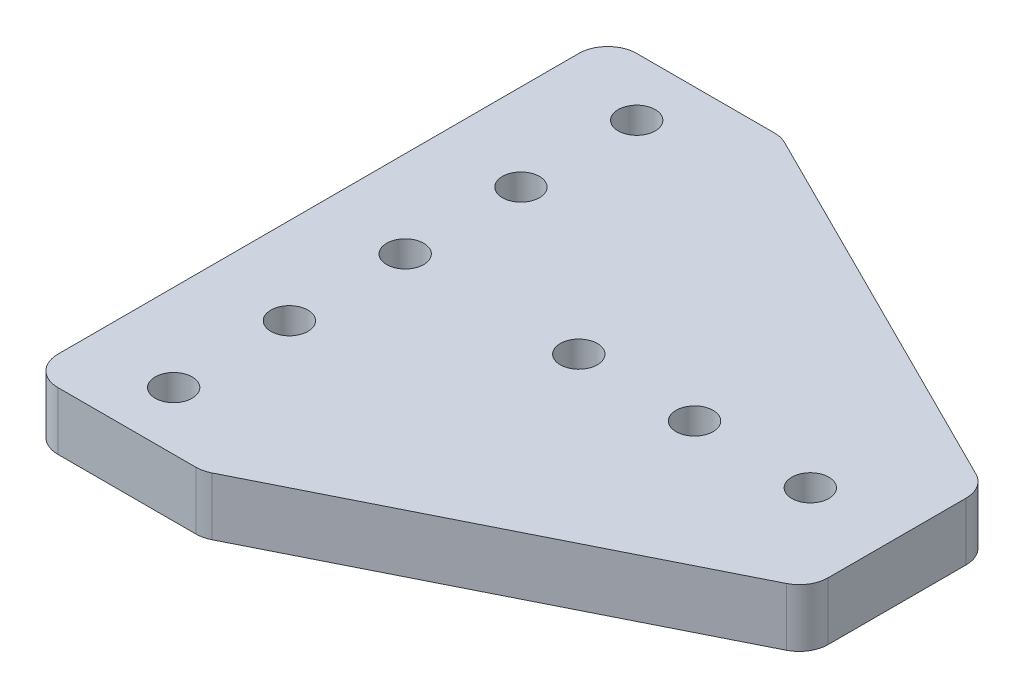
ISO-10303-21;
HEADER;
FILE_DESCRIPTION(('STEP AP214'),'2;1');
FILE_NAME('part.step','',(''),(''),'','','');
FILE_SCHEMA(('AUTOMOTIVE_DESIGN { 1 0 10303 214 1 1 1 1 }'));
ENDSEC;
DATA;
#1=APPLICATION_CONTEXT('core data for automotive mechanical design processes');
#2=APPLICATION_PROTOCOL_DEFINITION('international standard','automotive_design',2000,#1);
#3=PRODUCT_CONTEXT('',#1,'mechanical');
#4=PRODUCT('Part','Part','',(#3));
#5=PRODUCT_RELATED_PRODUCT_CATEGORY('part','',(#4));
#6=PRODUCT_DEFINITION_FORMATION('','',#4);
#7=PRODUCT_DEFINITION_CONTEXT('part definition',#1,'design');
#8=PRODUCT_DEFINITION('design','',#6,#7);
#9=PRODUCT_DEFINITION_SHAPE('','',#8);
#10=(LENGTH_UNIT() NAMED_UNIT(*) SI_UNIT(.MILLI.,.METRE.));
#11=(NAMED_UNIT(*) PLANE_ANGLE_UNIT() SI_UNIT($,.RADIAN.));
#12=(NAMED_UNIT(*) SI_UNIT($,.STERADIAN.) SOLID_ANGLE_UNIT());
#13=UNCERTAINTY_MEASURE_WITH_UNIT(LENGTH_MEASURE(1.E-05),#10,'distance_accuracy_value','');
#14=(GEOMETRIC_REPRESENTATION_CONTEXT(3) GLOBAL_UNCERTAINTY_ASSIGNED_CONTEXT((#13)) GLOBAL_UNIT_ASSIGNED_CONTEXT((#10,
#11,#12)) REPRESENTATION_CONTEXT('',''));
#15=CARTESIAN_POINT('',(0.,0.,0.));
#16=DIRECTION('',(0.,0.,1.));
#17=DIRECTION('',(1.,0.,0.));
#18=AXIS2_PLACEMENT_3D('',#15,#16,#17);
#19=CARTESIAN_POINT('',(0.,12.7,0.));
#20=DIRECTION('',(0.,-1.,0.));
#21=DIRECTION('',(0.,0.,-1.));
#22=AXIS2_PLACEMENT_3D('',#19,#20,#21);
#23=PLANE('',#22);
#24=DIRECTION('',(-0.894427190999916,0.,-0.447213595499958));
#25=VECTOR('',#24,1.);
#26=CARTESIAN_POINT('',(38.1,12.7,-127.));
#27=LINE('',#26,#25);
#28=CARTESIAN_POINT('',(123.489806331425,12.7,-84.3050968342877));
#29=VERTEX_POINT('',#28);
#30=CARTESIAN_POINT('',(39.4407746743011,12.7,-126.329612662849));
#31=VERTEX_POINT('',#30);
#32=EDGE_CURVE('E263',#29,#31,#27,.T.);
#33=ORIENTED_EDGE('',*,*,#32,.T.);
#34=CARTESIAN_POINT('',(36.6009683428763,12.7,-120.65));
#35=DIRECTION('',(0.,-1.,0.));
#36=DIRECTION('',(0.,0.,-1.));
#37=AXIS2_PLACEMENT_3D('',#34,#35,#36);
#38=CIRCLE('',#37,6.35);
#39=CARTESIAN_POINT('',(36.6009683428763,12.7,-127.));
#40=VERTEX_POINT('',#39);
#41=EDGE_CURVE('E211',#31,#40,#38,.F.);
#42=ORIENTED_EDGE('',*,*,#41,.T.);
#43=DIRECTION('',(-1.,0.,0.));
#44=VECTOR('',#43,1.);
#45=CARTESIAN_POINT('',(0.,12.7,-127.));
#46=LINE('',#45,#44);
#47=CARTESIAN_POINT('',(6.35,12.7,-127.));
#48=VERTEX_POINT('',#47);
#49=EDGE_CURVE('E156',#40,#48,#46,.T.);
#50=ORIENTED_EDGE('',*,*,#49,.T.);
#51=CARTESIAN_POINT('',(6.35,12.7,-120.65));
#52=DIRECTION('',(0.,-1.,0.));
#53=DIRECTION('',(0.,0.,-1.));
#54=AXIS2_PLACEMENT_3D('',#51,#52,#53);
#55=CIRCLE('',#54,6.35);
#56=CARTESIAN_POINT('',(0.,12.7,-120.65));
#57=VERTEX_POINT('',#56);
#58=EDGE_CURVE('E68',#48,#57,#55,.F.);
#59=ORIENTED_EDGE('',*,*,#58,.T.);
#60=DIRECTION('',(0.,0.,1.));
#61=VECTOR('',#60,1.);
#62=CARTESIAN_POINT('',(0.,12.7,0.));
#63=LINE('',#62,#61);
#64=CARTESIAN_POINT('',(0.,12.7,-6.35));
#65=VERTEX_POINT('',#64);
#66=EDGE_CURVE('E177',#57,#65,#63,.T.);
#67=ORIENTED_EDGE('',*,*,#66,.T.);
#68=CARTESIAN_POINT('',(6.35,12.7,-6.35));
#69=DIRECTION('',(0.,-1.,0.));
#70=DIRECTION('',(0.,0.,-1.));
#71=AXIS2_PLACEMENT_3D('',#68,#69,#70);
#72=CIRCLE('',#71,6.35);
#73=CARTESIAN_POINT('',(6.35000000000002,12.7,0.));
#74=VERTEX_POINT('',#73);
#75=EDGE_CURVE('E206',#65,#74,#72,.F.);
#76=ORIENTED_EDGE('',*,*,#75,.T.);
#77=DIRECTION('',(1.,0.,0.));
#78=VECTOR('',#77,1.);
#79=CARTESIAN_POINT('',(38.1,12.7,0.));
#80=LINE('',#79,#78);
#81=CARTESIAN_POINT('',(36.6009683428763,12.7,0.));
#82=VERTEX_POINT('',#81);
#83=EDGE_CURVE('E170',#74,#82,#80,.T.);
#84=ORIENTED_EDGE('',*,*,#83,.T.);
#85=CARTESIAN_POINT('',(36.6009683428763,12.7,-6.35));
#86=DIRECTION('',(0.,-1.,0.));
#87=DIRECTION('',(0.,0.,-1.));
#88=AXIS2_PLACEMENT_3D('',#85,#86,#87);
#89=CIRCLE('',#88,6.35);
#90=CARTESIAN_POINT('',(39.440774674301,12.7,-0.670387337150524));
#91=VERTEX_POINT('',#90);
#92=EDGE_CURVE('E197',#82,#91,#89,.F.);
#93=ORIENTED_EDGE('',*,*,#92,.T.);
#94=DIRECTION('',(0.894427190999916,0.,-0.447213595499958));
#95=VECTOR('',#94,1.);
#96=CARTESIAN_POINT('',(127.,12.7,-44.45));
#97=LINE('',#96,#95);
#98=CARTESIAN_POINT('',(123.489806331425,12.7,-42.6949031657124));
#99=VERTEX_POINT('',#98);
#100=EDGE_CURVE('E244',#91,#99,#97,.T.);
#101=ORIENTED_EDGE('',*,*,#100,.T.);
#102=CARTESIAN_POINT('',(120.65,12.7,-48.3745158285619));
#103=DIRECTION('',(0.,-1.,0.));
#104=DIRECTION('',(0.,0.,-1.));
#105=AXIS2_PLACEMENT_3D('',#102,#103,#104);
#106=CIRCLE('',#105,6.35);
#107=CARTESIAN_POINT('',(127.,12.7,-48.3745158285619));
#108=VERTEX_POINT('',#107);
#109=EDGE_CURVE('E200',#99,#108,#106,.F.);
#110=ORIENTED_EDGE('',*,*,#109,.T.);
#111=DIRECTION('',(0.,0.,-1.));
#112=VECTOR('',#111,1.);
#113=CARTESIAN_POINT('',(127.,12.7,-82.55));
#114=LINE('',#113,#112);
#115=CARTESIAN_POINT('',(127.,12.7,-78.6254841714382));
#116=VERTEX_POINT('',#115);
#117=EDGE_CURVE('E267',#108,#116,#114,.T.);
#118=ORIENTED_EDGE('',*,*,#117,.T.);
#119=CARTESIAN_POINT('',(120.65,12.7,-78.6254841714382));
#120=DIRECTION('',(0.,-1.,0.));
#121=DIRECTION('',(0.,0.,-1.));
#122=AXIS2_PLACEMENT_3D('',#119,#120,#121);
#123=CIRCLE('',#122,6.35);
#124=EDGE_CURVE('E203',#116,#29,#123,.F.);
#125=ORIENTED_EDGE('',*,*,#124,.T.);
#126=EDGE_LOOP('',(#33,#42,#50,#59,#67,#76,#84,#93,#101,#110,#118,#125));
#127=FACE_BOUND('',#126,.T.);
#128=CARTESIAN_POINT('',(19.05,12.7,-12.7));
#129=DIRECTION('',(0.,1.,0.));
#130=DIRECTION('',(0.,0.,1.));
#131=AXIS2_PLACEMENT_3D('',#128,#129,#130);
#132=CIRCLE('',#131,4.064);
#133=CARTESIAN_POINT('',(19.05,12.7,-8.636));
#134=VERTEX_POINT('',#133);
#135=EDGE_CURVE('E256',#134,#134,#132,.T.);
#136=ORIENTED_EDGE('',*,*,#135,.F.);
#137=EDGE_LOOP('',(#136));
#138=FACE_BOUND('',#137,.T.);
#139=CARTESIAN_POINT('',(19.05,12.7,-38.1));
#140=DIRECTION('',(0.,1.,0.));
#141=DIRECTION('',(0.,0.,1.));
#142=AXIS2_PLACEMENT_3D('',#139,#140,#141);
#143=CIRCLE('',#142,4.064);
#144=CARTESIAN_POINT('',(19.05,12.7,-34.036));
#145=VERTEX_POINT('',#144);
#146=EDGE_CURVE('E280',#145,#145,#143,.T.);
#147=ORIENTED_EDGE('',*,*,#146,.F.);
#148=EDGE_LOOP('',(#147));
#149=FACE_BOUND('',#148,.T.);
#150=CARTESIAN_POINT('',(19.05,12.7,-63.5));
#151=DIRECTION('',(0.,1.,0.));
#152=DIRECTION('',(0.,0.,1.));
#153=AXIS2_PLACEMENT_3D('',#150,#151,#152);
#154=CIRCLE('',#153,4.06400000000001);
#155=CARTESIAN_POINT('',(19.05,12.7,-59.436));
#156=VERTEX_POINT('',#155);
#157=EDGE_CURVE('E288',#156,#156,#154,.T.);
#158=ORIENTED_EDGE('',*,*,#157,.F.);
#159=EDGE_LOOP('',(#158));
#160=FACE_BOUND('',#159,.T.);
#161=CARTESIAN_POINT('',(19.05,12.7,-88.9));
#162=DIRECTION('',(0.,1.,0.));
#163=DIRECTION('',(0.,0.,1.));
#164=AXIS2_PLACEMENT_3D('',#161,#162,#163);
#165=CIRCLE('',#164,4.06399999999998);
#166=CARTESIAN_POINT('',(19.05,12.7,-84.836));
#167=VERTEX_POINT('',#166);
#168=EDGE_CURVE('E296',#167,#167,#165,.T.);
#169=ORIENTED_EDGE('',*,*,#168,.F.);
#170=EDGE_LOOP('',(#169));
#171=FACE_BOUND('',#170,.T.);
#172=CARTESIAN_POINT('',(19.05,12.7,-114.3));
#173=DIRECTION('',(0.,1.,0.));
#174=DIRECTION('',(0.,0.,1.));
#175=AXIS2_PLACEMENT_3D('',#172,#173,#174);
#176=CIRCLE('',#175,4.06399999999999);
#177=CARTESIAN_POINT('',(19.05,12.7,-110.236));
#178=VERTEX_POINT('',#177);
#179=EDGE_CURVE('E304',#178,#178,#176,.T.);
#180=ORIENTED_EDGE('',*,*,#179,.F.);
#181=EDGE_LOOP('',(#180));
#182=FACE_BOUND('',#181,.T.);
#183=CARTESIAN_POINT('',(107.95,12.7,-63.5));
#184=DIRECTION('',(0.,1.,0.));
#185=DIRECTION('',(0.,0.,1.));
#186=AXIS2_PLACEMENT_3D('',#183,#184,#185);
#187=CIRCLE('',#186,4.064);
#188=CARTESIAN_POINT('',(107.95,12.7,-59.436));
#189=VERTEX_POINT('',#188);
#190=EDGE_CURVE('E312',#189,#189,#187,.T.);
#191=ORIENTED_EDGE('',*,*,#190,.F.);
#192=EDGE_LOOP('',(#191));
#193=FACE_BOUND('',#192,.T.);
#194=CARTESIAN_POINT('',(82.55,12.7,-63.5));
#195=DIRECTION('',(0.,1.,0.));
#196=DIRECTION('',(0.,0.,1.));
#197=AXIS2_PLACEMENT_3D('',#194,#195,#196);
#198=CIRCLE('',#197,4.06400000000002);
#199=CARTESIAN_POINT('',(82.55,12.7,-59.436));
#200=VERTEX_POINT('',#199);
#201=EDGE_CURVE('E320',#200,#200,#198,.T.);
#202=ORIENTED_EDGE('',*,*,#201,.F.);
#203=EDGE_LOOP('',(#202));
#204=FACE_BOUND('',#203,.T.);
#205=CARTESIAN_POINT('',(57.15,12.7,-63.5));
#206=DIRECTION('',(0.,1.,0.));
#207=DIRECTION('',(0.,0.,1.));
#208=AXIS2_PLACEMENT_3D('',#205,#206,#207);
#209=CIRCLE('',#208,4.064);
#210=CARTESIAN_POINT('',(57.15,12.7,-59.436));
#211=VERTEX_POINT('',#210);
#212=EDGE_CURVE('E328',#211,#211,#209,.T.);
#213=ORIENTED_EDGE('',*,*,#212,.F.);
#214=EDGE_LOOP('',(#213));
#215=FACE_BOUND('',#214,.T.);
#216=ADVANCED_FACE('F45',(#127,#138,#149,#160,#171,#182,#193,#204,#215),#23,.F.);
#217=CARTESIAN_POINT('',(0.,0.,0.));
#218=DIRECTION('',(0.,-1.,0.));
#219=DIRECTION('',(0.,0.,-1.));
#220=AXIS2_PLACEMENT_3D('',#217,#218,#219);
#221=PLANE('',#220);
#222=CARTESIAN_POINT('',(82.55,0.,-63.5));
#223=DIRECTION('',(0.,1.,0.));
#224=DIRECTION('',(0.,0.,1.));
#225=AXIS2_PLACEMENT_3D('',#222,#223,#224);
#226=CIRCLE('',#225,4.06400000000002);
#227=CARTESIAN_POINT('',(82.55,0.,-59.436));
#228=VERTEX_POINT('',#227);
#229=EDGE_CURVE('E324',#228,#228,#226,.T.);
#230=ORIENTED_EDGE('',*,*,#229,.T.);
#231=EDGE_LOOP('',(#230));
#232=FACE_BOUND('',#231,.T.);
#233=CARTESIAN_POINT('',(19.05,0.,-114.3));
#234=DIRECTION('',(0.,1.,0.));
#235=DIRECTION('',(0.,0.,1.));
#236=AXIS2_PLACEMENT_3D('',#233,#234,#235);
#237=CIRCLE('',#236,4.06399999999999);
#238=CARTESIAN_POINT('',(19.05,0.,-110.236));
#239=VERTEX_POINT('',#238);
#240=EDGE_CURVE('E308',#239,#239,#237,.T.);
#241=ORIENTED_EDGE('',*,*,#240,.T.);
#242=EDGE_LOOP('',(#241));
#243=FACE_BOUND('',#242,.T.);
#244=CARTESIAN_POINT('',(19.05,0.,-63.5));
#245=DIRECTION('',(0.,1.,0.));
#246=DIRECTION('',(0.,0.,1.));
#247=AXIS2_PLACEMENT_3D('',#244,#245,#246);
#248=CIRCLE('',#247,4.06400000000001);
#249=CARTESIAN_POINT('',(19.05,0.,-59.436));
#250=VERTEX_POINT('',#249);
#251=EDGE_CURVE('E292',#250,#250,#248,.T.);
#252=ORIENTED_EDGE('',*,*,#251,.T.);
#253=EDGE_LOOP('',(#252));
#254=FACE_BOUND('',#253,.T.);
#255=CARTESIAN_POINT('',(19.05,0.,-12.7));
#256=DIRECTION('',(0.,1.,0.));
#257=DIRECTION('',(0.,0.,1.));
#258=AXIS2_PLACEMENT_3D('',#255,#256,#257);
#259=CIRCLE('',#258,4.064);
#260=CARTESIAN_POINT('',(19.05,0.,-8.636));
#261=VERTEX_POINT('',#260);
#262=EDGE_CURVE('E276',#261,#261,#259,.T.);
#263=ORIENTED_EDGE('',*,*,#262,.T.);
#264=EDGE_LOOP('',(#263));
#265=FACE_BOUND('',#264,.T.);
#266=DIRECTION('',(-1.,0.,0.));
#267=VECTOR('',#266,1.);
#268=CARTESIAN_POINT('',(0.,0.,-127.));
#269=LINE('',#268,#267);
#270=CARTESIAN_POINT('',(36.6009683428763,0.,-127.));
#271=VERTEX_POINT('',#270);
#272=CARTESIAN_POINT('',(6.35,0.,-127.));
#273=VERTEX_POINT('',#272);
#274=EDGE_CURVE('E154',#271,#273,#269,.T.);
#275=ORIENTED_EDGE('',*,*,#274,.F.);
#276=CARTESIAN_POINT('',(36.6009683428763,0.,-120.65));
#277=DIRECTION('',(0.,-1.,0.));
#278=DIRECTION('',(0.,0.,-1.));
#279=AXIS2_PLACEMENT_3D('',#276,#277,#278);
#280=CIRCLE('',#279,6.35);
#281=CARTESIAN_POINT('',(39.4407746743011,0.,-126.329612662849));
#282=VERTEX_POINT('',#281);
#283=EDGE_CURVE('E136',#271,#282,#280,.T.);
#284=ORIENTED_EDGE('',*,*,#283,.T.);
#285=DIRECTION('',(-0.894427190999916,0.,-0.447213595499958));
#286=VECTOR('',#285,1.);
#287=CARTESIAN_POINT('',(38.1,0.,-127.));
#288=LINE('',#287,#286);
#289=CARTESIAN_POINT('',(123.489806331425,0.,-84.3050968342877));
#290=VERTEX_POINT('',#289);
#291=EDGE_CURVE('E166',#290,#282,#288,.T.);
#292=ORIENTED_EDGE('',*,*,#291,.F.);
#293=CARTESIAN_POINT('',(120.65,0.,-78.6254841714382));
#294=DIRECTION('',(0.,-1.,0.));
#295=DIRECTION('',(0.,0.,-1.));
#296=AXIS2_PLACEMENT_3D('',#293,#294,#295);
#297=CIRCLE('',#296,6.35);
#298=CARTESIAN_POINT('',(127.,0.,-78.6254841714382));
#299=VERTEX_POINT('',#298);
#300=EDGE_CURVE('E184',#290,#299,#297,.T.);
#301=ORIENTED_EDGE('',*,*,#300,.T.);
#302=DIRECTION('',(0.,0.,-1.));
#303=VECTOR('',#302,1.);
#304=CARTESIAN_POINT('',(127.,0.,-82.55));
#305=LINE('',#304,#303);
#306=CARTESIAN_POINT('',(127.,0.,-48.3745158285619));
#307=VERTEX_POINT('',#306);
#308=EDGE_CURVE('E172',#307,#299,#305,.T.);
#309=ORIENTED_EDGE('',*,*,#308,.F.);
#310=CARTESIAN_POINT('',(120.65,0.,-48.3745158285619));
#311=DIRECTION('',(0.,-1.,0.));
#312=DIRECTION('',(0.,0.,-1.));
#313=AXIS2_PLACEMENT_3D('',#310,#311,#312);
#314=CIRCLE('',#313,6.35);
#315=CARTESIAN_POINT('',(123.489806331425,0.,-42.6949031657124));
#316=VERTEX_POINT('',#315);
#317=EDGE_CURVE('E181',#307,#316,#314,.T.);
#318=ORIENTED_EDGE('',*,*,#317,.T.);
#319=DIRECTION('',(0.894427190999916,0.,-0.447213595499958));
#320=VECTOR('',#319,1.);
#321=CARTESIAN_POINT('',(127.,0.,-44.45));
#322=LINE('',#321,#320);
#323=CARTESIAN_POINT('',(39.440774674301,0.,-0.670387337150524));
#324=VERTEX_POINT('',#323);
#325=EDGE_CURVE('E241',#324,#316,#322,.T.);
#326=ORIENTED_EDGE('',*,*,#325,.F.);
#327=CARTESIAN_POINT('',(36.6009683428763,0.,-6.35));
#328=DIRECTION('',(0.,-1.,0.));
#329=DIRECTION('',(0.,0.,-1.));
#330=AXIS2_PLACEMENT_3D('',#327,#328,#329);
#331=CIRCLE('',#330,6.35);
#332=CARTESIAN_POINT('',(36.6009683428763,0.,0.));
#333=VERTEX_POINT('',#332);
#334=EDGE_CURVE('E158',#324,#333,#331,.T.);
#335=ORIENTED_EDGE('',*,*,#334,.T.);
#336=DIRECTION('',(1.,0.,0.));
#337=VECTOR('',#336,1.);
#338=CARTESIAN_POINT('',(38.1,0.,0.));
#339=LINE('',#338,#337);
#340=CARTESIAN_POINT('',(6.35000000000002,0.,0.));
#341=VERTEX_POINT('',#340);
#342=EDGE_CURVE('E251',#341,#333,#339,.T.);
#343=ORIENTED_EDGE('',*,*,#342,.F.);
#344=CARTESIAN_POINT('',(6.35,0.,-6.35));
#345=DIRECTION('',(0.,-1.,0.));
#346=DIRECTION('',(0.,0.,-1.));
#347=AXIS2_PLACEMENT_3D('',#344,#345,#346);
#348=CIRCLE('',#347,6.35);
#349=CARTESIAN_POINT('',(0.,0.,-6.35));
#350=VERTEX_POINT('',#349);
#351=EDGE_CURVE('E187',#341,#350,#348,.T.);
#352=ORIENTED_EDGE('',*,*,#351,.T.);
#353=DIRECTION('',(0.,0.,1.));
#354=VECTOR('',#353,1.);
#355=CARTESIAN_POINT('',(0.,0.,0.));
#356=LINE('',#355,#354);
#357=CARTESIAN_POINT('',(0.,0.,-120.65));
#358=VERTEX_POINT('',#357);
#359=EDGE_CURVE('E165',#358,#350,#356,.T.);
#360=ORIENTED_EDGE('',*,*,#359,.F.);
#361=CARTESIAN_POINT('',(6.35,0.,-120.65));
#362=DIRECTION('',(0.,-1.,0.));
#363=DIRECTION('',(0.,0.,-1.));
#364=AXIS2_PLACEMENT_3D('',#361,#362,#363);
#365=CIRCLE('',#364,6.35);
#366=EDGE_CURVE('E148',#358,#273,#365,.T.);
#367=ORIENTED_EDGE('',*,*,#366,.T.);
#368=EDGE_LOOP('',(#275,#284,#292,#301,#309,#318,#326,#335,#343,#352,#360,#367));
#369=FACE_BOUND('',#368,.T.);
#370=CARTESIAN_POINT('',(19.05,0.,-38.1));
#371=DIRECTION('',(0.,1.,0.));
#372=DIRECTION('',(0.,0.,1.));
#373=AXIS2_PLACEMENT_3D('',#370,#371,#372);
#374=CIRCLE('',#373,4.064);
#375=CARTESIAN_POINT('',(19.05,0.,-34.036));
#376=VERTEX_POINT('',#375);
#377=EDGE_CURVE('E284',#376,#376,#374,.T.);
#378=ORIENTED_EDGE('',*,*,#377,.T.);
#379=EDGE_LOOP('',(#378));
#380=FACE_BOUND('',#379,.T.);
#381=CARTESIAN_POINT('',(19.05,0.,-88.9));
#382=DIRECTION('',(0.,1.,0.));
#383=DIRECTION('',(0.,0.,1.));
#384=AXIS2_PLACEMENT_3D('',#381,#382,#383);
#385=CIRCLE('',#384,4.06399999999998);
#386=CARTESIAN_POINT('',(19.05,0.,-84.836));
#387=VERTEX_POINT('',#386);
#388=EDGE_CURVE('E300',#387,#387,#385,.T.);
#389=ORIENTED_EDGE('',*,*,#388,.T.);
#390=EDGE_LOOP('',(#389));
#391=FACE_BOUND('',#390,.T.);
#392=CARTESIAN_POINT('',(107.95,0.,-63.5));
#393=DIRECTION('',(0.,1.,0.));
#394=DIRECTION('',(0.,0.,1.));
#395=AXIS2_PLACEMENT_3D('',#392,#393,#394);
#396=CIRCLE('',#395,4.064);
#397=CARTESIAN_POINT('',(107.95,0.,-59.436));
#398=VERTEX_POINT('',#397);
#399=EDGE_CURVE('E316',#398,#398,#396,.T.);
#400=ORIENTED_EDGE('',*,*,#399,.T.);
#401=EDGE_LOOP('',(#400));
#402=FACE_BOUND('',#401,.T.);
#403=CARTESIAN_POINT('',(57.15,0.,-63.5));
#404=DIRECTION('',(0.,1.,0.));
#405=DIRECTION('',(0.,0.,1.));
#406=AXIS2_PLACEMENT_3D('',#403,#404,#405);
#407=CIRCLE('',#406,4.064);
#408=CARTESIAN_POINT('',(57.15,0.,-59.436));
#409=VERTEX_POINT('',#408);
#410=EDGE_CURVE('E332',#409,#409,#407,.T.);
#411=ORIENTED_EDGE('',*,*,#410,.T.);
#412=EDGE_LOOP('',(#411));
#413=FACE_BOUND('',#412,.T.);
#414=ADVANCED_FACE('F161',(#232,#243,#254,#265,#369,#380,#391,#402,#413),#221,.T.);
#415=CARTESIAN_POINT('',(38.1,12.7,0.));
#416=DIRECTION('',(0.,0.,-1.));
#417=DIRECTION('',(-1.,0.,0.));
#418=AXIS2_PLACEMENT_3D('',#415,#416,#417);
#419=PLANE('',#418);
#420=ORIENTED_EDGE('',*,*,#83,.F.);
#421=DIRECTION('',(0.,-1.,0.));
#422=VECTOR('',#421,1.);
#423=CARTESIAN_POINT('',(6.35,12.7,0.));
#424=LINE('',#423,#422);
#425=EDGE_CURVE('E223',#74,#341,#424,.T.);
#426=ORIENTED_EDGE('',*,*,#425,.T.);
#427=ORIENTED_EDGE('',*,*,#342,.T.);
#428=DIRECTION('',(0.,-1.,0.));
#429=VECTOR('',#428,1.);
#430=CARTESIAN_POINT('',(36.6009683428763,12.7,0.));
#431=LINE('',#430,#429);
#432=EDGE_CURVE('E220',#333,#82,#431,.F.);
#433=ORIENTED_EDGE('',*,*,#432,.T.);
#434=EDGE_LOOP('',(#420,#426,#427,#433));
#435=FACE_BOUND('',#434,.T.);
#436=ADVANCED_FACE('F349',(#435),#419,.F.);
#437=CARTESIAN_POINT('',(127.,12.7,-44.45));
#438=DIRECTION('',(-0.447213595499958,0.,-0.894427190999916));
#439=DIRECTION('',(-0.894427190999916,0.,0.447213595499958));
#440=AXIS2_PLACEMENT_3D('',#437,#438,#439);
#441=PLANE('',#440);
#442=ORIENTED_EDGE('',*,*,#325,.T.);
#443=DIRECTION('',(0.,-1.,0.));
#444=VECTOR('',#443,1.);
#445=CARTESIAN_POINT('',(123.489806331425,12.7,-42.6949031657124));
#446=LINE('',#445,#444);
#447=EDGE_CURVE('E11',#316,#99,#446,.F.);
#448=ORIENTED_EDGE('',*,*,#447,.T.);
#449=ORIENTED_EDGE('',*,*,#100,.F.);
#450=DIRECTION('',(0.,-1.,0.));
#451=VECTOR('',#450,1.);
#452=CARTESIAN_POINT('',(39.4407746743011,12.7,-0.670387337150531));
#453=LINE('',#452,#451);
#454=EDGE_CURVE('E54',#91,#324,#453,.T.);
#455=ORIENTED_EDGE('',*,*,#454,.T.);
#456=EDGE_LOOP('',(#442,#448,#449,#455));
#457=FACE_BOUND('',#456,.T.);
#458=ADVANCED_FACE('F240',(#457),#441,.F.);
#459=CARTESIAN_POINT('',(127.,12.7,-82.55));
#460=DIRECTION('',(-1.,0.,0.));
#461=DIRECTION('',(0.,0.,1.));
#462=AXIS2_PLACEMENT_3D('',#459,#460,#461);
#463=PLANE('',#462);
#464=ORIENTED_EDGE('',*,*,#308,.T.);
#465=DIRECTION('',(0.,-1.,0.));
#466=VECTOR('',#465,1.);
#467=CARTESIAN_POINT('',(127.,12.7,-78.6254841714382));
#468=LINE('',#467,#466);
#469=EDGE_CURVE('E231',#299,#116,#468,.F.);
#470=ORIENTED_EDGE('',*,*,#469,.T.);
#471=ORIENTED_EDGE('',*,*,#117,.F.);
#472=DIRECTION('',(0.,-1.,0.));
#473=VECTOR('',#472,1.);
#474=CARTESIAN_POINT('',(127.,12.7,-48.3745158285619));
#475=LINE('',#474,#473);
#476=EDGE_CURVE('E227',#108,#307,#475,.T.);
#477=ORIENTED_EDGE('',*,*,#476,.T.);
#478=EDGE_LOOP('',(#464,#470,#471,#477));
#479=FACE_BOUND('',#478,.T.);
#480=ADVANCED_FACE('F365',(#479),#463,.F.);
#481=CARTESIAN_POINT('',(38.1,12.7,-127.));
#482=DIRECTION('',(-0.447213595499958,0.,0.894427190999916));
#483=DIRECTION('',(0.894427190999916,0.,0.447213595499958));
#484=AXIS2_PLACEMENT_3D('',#481,#482,#483);
#485=PLANE('',#484);
#486=ORIENTED_EDGE('',*,*,#291,.T.);
#487=DIRECTION('',(0.,-1.,0.));
#488=VECTOR('',#487,1.);
#489=CARTESIAN_POINT('',(39.4407746743011,12.7,-126.329612662849));
#490=LINE('',#489,#488);
#491=EDGE_CURVE('E141',#282,#31,#490,.F.);
#492=ORIENTED_EDGE('',*,*,#491,.T.);
#493=ORIENTED_EDGE('',*,*,#32,.F.);
#494=DIRECTION('',(0.,-1.,0.));
#495=VECTOR('',#494,1.);
#496=CARTESIAN_POINT('',(123.489806331425,12.7,-84.3050968342877));
#497=LINE('',#496,#495);
#498=EDGE_CURVE('E147',#29,#290,#497,.T.);
#499=ORIENTED_EDGE('',*,*,#498,.T.);
#500=EDGE_LOOP('',(#486,#492,#493,#499));
#501=FACE_BOUND('',#500,.T.);
#502=ADVANCED_FACE('F362',(#501),#485,.F.);
#503=CARTESIAN_POINT('',(0.,12.7,-127.));
#504=DIRECTION('',(0.,0.,1.));
#505=DIRECTION('',(1.,0.,0.));
#506=AXIS2_PLACEMENT_3D('',#503,#504,#505);
#507=PLANE('',#506);
#508=ORIENTED_EDGE('',*,*,#49,.F.);
#509=DIRECTION('',(0.,-1.,0.));
#510=VECTOR('',#509,1.);
#511=CARTESIAN_POINT('',(36.6009683428763,12.7,-127.));
#512=LINE('',#511,#510);
#513=EDGE_CURVE('E140',#40,#271,#512,.T.);
#514=ORIENTED_EDGE('',*,*,#513,.T.);
#515=ORIENTED_EDGE('',*,*,#274,.T.);
#516=DIRECTION('',(0.,-1.,0.));
#517=VECTOR('',#516,1.);
#518=CARTESIAN_POINT('',(6.35,12.7,-127.));
#519=LINE('',#518,#517);
#520=EDGE_CURVE('E159',#273,#48,#519,.F.);
#521=ORIENTED_EDGE('',*,*,#520,.T.);
#522=EDGE_LOOP('',(#508,#514,#515,#521));
#523=FACE_BOUND('',#522,.T.);
#524=ADVANCED_FACE('F153',(#523),#507,.F.);
#525=CARTESIAN_POINT('',(0.,12.7,0.));
#526=DIRECTION('',(1.,0.,0.));
#527=DIRECTION('',(0.,0.,-1.));
#528=AXIS2_PLACEMENT_3D('',#525,#526,#527);
#529=PLANE('',#528);
#530=ORIENTED_EDGE('',*,*,#66,.F.);
#531=DIRECTION('',(0.,-1.,0.));
#532=VECTOR('',#531,1.);
#533=CARTESIAN_POINT('',(0.,12.7,-120.65));
#534=LINE('',#533,#532);
#535=EDGE_CURVE('E216',#57,#358,#534,.T.);
#536=ORIENTED_EDGE('',*,*,#535,.T.);
#537=ORIENTED_EDGE('',*,*,#359,.T.);
#538=DIRECTION('',(0.,-1.,0.));
#539=VECTOR('',#538,1.);
#540=CARTESIAN_POINT('',(0.,12.7,-6.35));
#541=LINE('',#540,#539);
#542=EDGE_CURVE('E61',#350,#65,#541,.F.);
#543=ORIENTED_EDGE('',*,*,#542,.T.);
#544=EDGE_LOOP('',(#530,#536,#537,#543));
#545=FACE_BOUND('',#544,.T.);
#546=ADVANCED_FACE('F357',(#545),#529,.F.);
#547=CARTESIAN_POINT('',(19.05,12.7,-12.7));
#548=DIRECTION('',(0.,-1.,0.));
#549=DIRECTION('',(0.,0.,-1.));
#550=AXIS2_PLACEMENT_3D('',#547,#548,#549);
#551=CYLINDRICAL_SURFACE('',#550,4.064);
#552=ORIENTED_EDGE('',*,*,#135,.T.);
#553=EDGE_LOOP('',(#552));
#554=FACE_BOUND('',#553,.T.);
#555=ORIENTED_EDGE('',*,*,#262,.F.);
#556=EDGE_LOOP('',(#555));
#557=FACE_BOUND('',#556,.T.);
#558=ADVANCED_FACE('F354',(#554,#557),#551,.F.);
#559=CARTESIAN_POINT('',(19.05,12.7,-38.1));
#560=DIRECTION('',(0.,-1.,0.));
#561=DIRECTION('',(0.,0.,-1.));
#562=AXIS2_PLACEMENT_3D('',#559,#560,#561);
#563=CYLINDRICAL_SURFACE('',#562,4.064);
#564=ORIENTED_EDGE('',*,*,#146,.T.);
#565=EDGE_LOOP('',(#564));
#566=FACE_BOUND('',#565,.T.);
#567=ORIENTED_EDGE('',*,*,#377,.F.);
#568=EDGE_LOOP('',(#567));
#569=FACE_BOUND('',#568,.T.);
#570=ADVANCED_FACE('F494',(#566,#569),#563,.F.);
#571=CARTESIAN_POINT('',(19.05,12.7,-63.5));
#572=DIRECTION('',(0.,-1.,0.));
#573=DIRECTION('',(0.,0.,-1.));
#574=AXIS2_PLACEMENT_3D('',#571,#572,#573);
#575=CYLINDRICAL_SURFACE('',#574,4.06400000000001);
#576=ORIENTED_EDGE('',*,*,#157,.T.);
#577=EDGE_LOOP('',(#576));
#578=FACE_BOUND('',#577,.T.);
#579=ORIENTED_EDGE('',*,*,#251,.F.);
#580=EDGE_LOOP('',(#579));
#581=FACE_BOUND('',#580,.T.);
#582=ADVANCED_FACE('F484',(#578,#581),#575,.F.);
#583=CARTESIAN_POINT('',(19.05,12.7,-88.9));
#584=DIRECTION('',(0.,-1.,0.));
#585=DIRECTION('',(0.,0.,-1.));
#586=AXIS2_PLACEMENT_3D('',#583,#584,#585);
#587=CYLINDRICAL_SURFACE('',#586,4.06399999999998);
#588=ORIENTED_EDGE('',*,*,#168,.T.);
#589=EDGE_LOOP('',(#588));
#590=FACE_BOUND('',#589,.T.);
#591=ORIENTED_EDGE('',*,*,#388,.F.);
#592=EDGE_LOOP('',(#591));
#593=FACE_BOUND('',#592,.T.);
#594=ADVANCED_FACE('F474',(#590,#593),#587,.F.);
#595=CARTESIAN_POINT('',(19.05,12.7,-114.3));
#596=DIRECTION('',(0.,-1.,0.));
#597=DIRECTION('',(0.,0.,-1.));
#598=AXIS2_PLACEMENT_3D('',#595,#596,#597);
#599=CYLINDRICAL_SURFACE('',#598,4.06399999999999);
#600=ORIENTED_EDGE('',*,*,#179,.T.);
#601=EDGE_LOOP('',(#600));
#602=FACE_BOUND('',#601,.T.);
#603=ORIENTED_EDGE('',*,*,#240,.F.);
#604=EDGE_LOOP('',(#603));
#605=FACE_BOUND('',#604,.T.);
#606=ADVANCED_FACE('F464',(#602,#605),#599,.F.);
#607=CARTESIAN_POINT('',(107.95,12.7,-63.5));
#608=DIRECTION('',(0.,-1.,0.));
#609=DIRECTION('',(0.,0.,-1.));
#610=AXIS2_PLACEMENT_3D('',#607,#608,#609);
#611=CYLINDRICAL_SURFACE('',#610,4.064);
#612=ORIENTED_EDGE('',*,*,#190,.T.);
#613=EDGE_LOOP('',(#612));
#614=FACE_BOUND('',#613,.T.);
#615=ORIENTED_EDGE('',*,*,#399,.F.);
#616=EDGE_LOOP('',(#615));
#617=FACE_BOUND('',#616,.T.);
#618=ADVANCED_FACE('F454',(#614,#617),#611,.F.);
#619=CARTESIAN_POINT('',(82.55,12.7,-63.5));
#620=DIRECTION('',(0.,-1.,0.));
#621=DIRECTION('',(0.,0.,-1.));
#622=AXIS2_PLACEMENT_3D('',#619,#620,#621);
#623=CYLINDRICAL_SURFACE('',#622,4.06400000000002);
#624=ORIENTED_EDGE('',*,*,#201,.T.);
#625=EDGE_LOOP('',(#624));
#626=FACE_BOUND('',#625,.T.);
#627=ORIENTED_EDGE('',*,*,#229,.F.);
#628=EDGE_LOOP('',(#627));
#629=FACE_BOUND('',#628,.T.);
#630=ADVANCED_FACE('F445',(#626,#629),#623,.F.);
#631=CARTESIAN_POINT('',(57.15,12.7,-63.5));
#632=DIRECTION('',(0.,-1.,0.));
#633=DIRECTION('',(0.,0.,-1.));
#634=AXIS2_PLACEMENT_3D('',#631,#632,#633);
#635=CYLINDRICAL_SURFACE('',#634,4.064);
#636=ORIENTED_EDGE('',*,*,#212,.T.);
#637=EDGE_LOOP('',(#636));
#638=FACE_BOUND('',#637,.T.);
#639=ORIENTED_EDGE('',*,*,#410,.F.);
#640=EDGE_LOOP('',(#639));
#641=FACE_BOUND('',#640,.T.);
#642=ADVANCED_FACE('F340',(#638,#641),#635,.F.);
#643=CARTESIAN_POINT('',(36.6009683428763,12.7,-120.65));
#644=DIRECTION('',(0.,-1.,0.));
#645=DIRECTION('',(0.,0.,-1.));
#646=AXIS2_PLACEMENT_3D('',#643,#644,#645);
#647=CYLINDRICAL_SURFACE('',#646,6.35);
#648=ORIENTED_EDGE('',*,*,#41,.F.);
#649=ORIENTED_EDGE('',*,*,#491,.F.);
#650=ORIENTED_EDGE('',*,*,#283,.F.);
#651=ORIENTED_EDGE('',*,*,#513,.F.);
#652=EDGE_LOOP('',(#648,#649,#650,#651));
#653=FACE_BOUND('',#652,.T.);
#654=ADVANCED_FACE('F139',(#653),#647,.T.);
#655=CARTESIAN_POINT('',(6.35,12.7,-120.65));
#656=DIRECTION('',(0.,-1.,0.));
#657=DIRECTION('',(0.,0.,-1.));
#658=AXIS2_PLACEMENT_3D('',#655,#656,#657);
#659=CYLINDRICAL_SURFACE('',#658,6.35);
#660=ORIENTED_EDGE('',*,*,#58,.F.);
#661=ORIENTED_EDGE('',*,*,#520,.F.);
#662=ORIENTED_EDGE('',*,*,#366,.F.);
#663=ORIENTED_EDGE('',*,*,#535,.F.);
#664=EDGE_LOOP('',(#660,#661,#662,#663));
#665=FACE_BOUND('',#664,.T.);
#666=ADVANCED_FACE('F377',(#665),#659,.T.);
#667=CARTESIAN_POINT('',(6.35,12.7,-6.35));
#668=DIRECTION('',(0.,-1.,0.));
#669=DIRECTION('',(0.,0.,-1.));
#670=AXIS2_PLACEMENT_3D('',#667,#668,#669);
#671=CYLINDRICAL_SURFACE('',#670,6.35);
#672=ORIENTED_EDGE('',*,*,#75,.F.);
#673=ORIENTED_EDGE('',*,*,#542,.F.);
#674=ORIENTED_EDGE('',*,*,#351,.F.);
#675=ORIENTED_EDGE('',*,*,#425,.F.);
#676=EDGE_LOOP('',(#672,#673,#674,#675));
#677=FACE_BOUND('',#676,.T.);
#678=ADVANCED_FACE('F380',(#677),#671,.T.);
#679=CARTESIAN_POINT('',(120.65,12.7,-78.6254841714382));
#680=DIRECTION('',(0.,-1.,0.));
#681=DIRECTION('',(0.,0.,-1.));
#682=AXIS2_PLACEMENT_3D('',#679,#680,#681);
#683=CYLINDRICAL_SURFACE('',#682,6.35);
#684=ORIENTED_EDGE('',*,*,#124,.F.);
#685=ORIENTED_EDGE('',*,*,#469,.F.);
#686=ORIENTED_EDGE('',*,*,#300,.F.);
#687=ORIENTED_EDGE('',*,*,#498,.F.);
#688=EDGE_LOOP('',(#684,#685,#686,#687));
#689=FACE_BOUND('',#688,.T.);
#690=ADVANCED_FACE('F384',(#689),#683,.T.);
#691=CARTESIAN_POINT('',(120.65,12.7,-48.3745158285619));
#692=DIRECTION('',(0.,-1.,0.));
#693=DIRECTION('',(0.,0.,-1.));
#694=AXIS2_PLACEMENT_3D('',#691,#692,#693);
#695=CYLINDRICAL_SURFACE('',#694,6.35);
#696=ORIENTED_EDGE('',*,*,#109,.F.);
#697=ORIENTED_EDGE('',*,*,#447,.F.);
#698=ORIENTED_EDGE('',*,*,#317,.F.);
#699=ORIENTED_EDGE('',*,*,#476,.F.);
#700=EDGE_LOOP('',(#696,#697,#698,#699));
#701=FACE_BOUND('',#700,.T.);
#702=ADVANCED_FACE('F387',(#701),#695,.T.);
#703=CARTESIAN_POINT('',(36.6009683428763,12.7,-6.35));
#704=DIRECTION('',(0.,-1.,0.));
#705=DIRECTION('',(0.,0.,-1.));
#706=AXIS2_PLACEMENT_3D('',#703,#704,#705);
#707=CYLINDRICAL_SURFACE('',#706,6.35);
#708=ORIENTED_EDGE('',*,*,#92,.F.);
#709=ORIENTED_EDGE('',*,*,#432,.F.);
#710=ORIENTED_EDGE('',*,*,#334,.F.);
#711=ORIENTED_EDGE('',*,*,#454,.F.);
#712=EDGE_LOOP('',(#708,#709,#710,#711));
#713=FACE_BOUND('',#712,.T.);
#714=ADVANCED_FACE('F47',(#713),#707,.T.);
#715=CLOSED_SHELL('',(#216,#414,#436,#458,#480,#502,#524,#546,#558,#570,#582,#594,#606,#618,
#630,#642,#654,#666,#678,#690,#702,#714));
#716=MANIFOLD_SOLID_BREP('B2',#715);
#717=ADVANCED_BREP_SHAPE_REPRESENTATION('',(#18,#716),#14);
#718=SHAPE_DEFINITION_REPRESENTATION(#9,#717);
ENDSEC;
END-ISO-10303-21;
